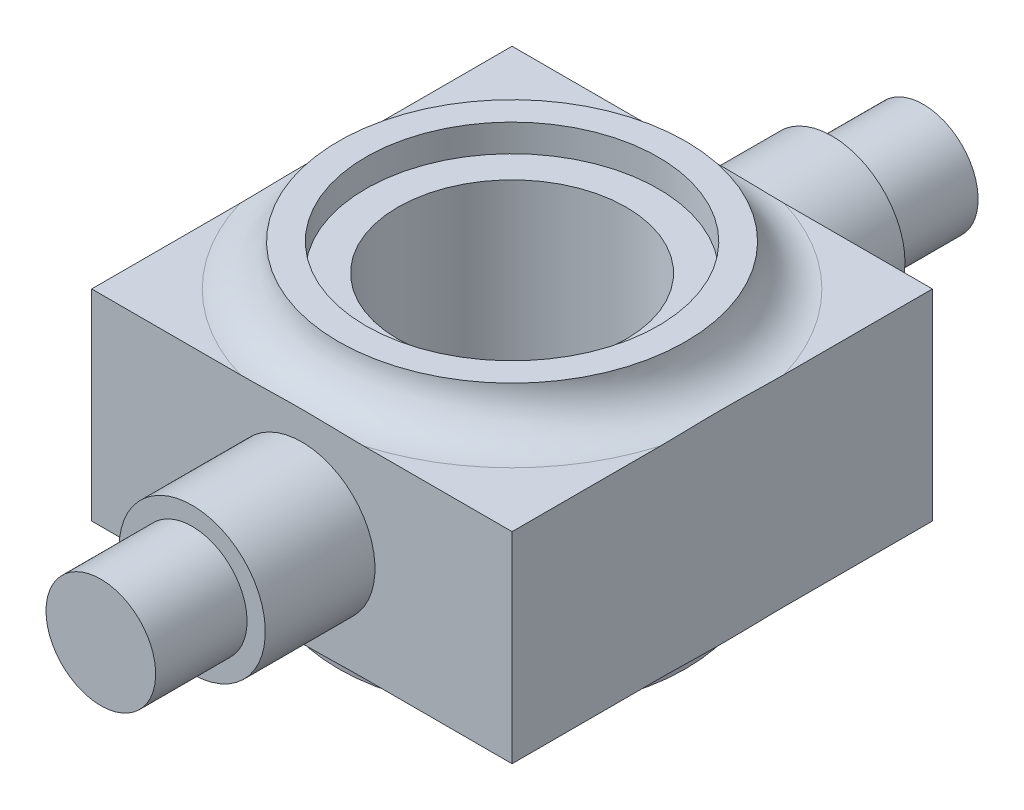
ISO-10303-21;
HEADER;
FILE_DESCRIPTION(('STEP AP214'),'2;1');
FILE_NAME('part.step','',(''),(''),'','','');
FILE_SCHEMA(('AUTOMOTIVE_DESIGN { 1 0 10303 214 1 1 1 1 }'));
ENDSEC;
DATA;
#1=APPLICATION_CONTEXT('core data for automotive mechanical design processes');
#2=APPLICATION_PROTOCOL_DEFINITION('international standard','automotive_design',2000,#1);
#3=PRODUCT_CONTEXT('',#1,'mechanical');
#4=PRODUCT('Part','Part','',(#3));
#5=PRODUCT_RELATED_PRODUCT_CATEGORY('part','',(#4));
#6=PRODUCT_DEFINITION_FORMATION('','',#4);
#7=PRODUCT_DEFINITION_CONTEXT('part definition',#1,'design');
#8=PRODUCT_DEFINITION('design','',#6,#7);
#9=PRODUCT_DEFINITION_SHAPE('','',#8);
#10=(LENGTH_UNIT() NAMED_UNIT(*) SI_UNIT(.MILLI.,.METRE.));
#11=(NAMED_UNIT(*) PLANE_ANGLE_UNIT() SI_UNIT($,.RADIAN.));
#12=(NAMED_UNIT(*) SI_UNIT($,.STERADIAN.) SOLID_ANGLE_UNIT());
#13=UNCERTAINTY_MEASURE_WITH_UNIT(LENGTH_MEASURE(1.E-05),#10,'distance_accuracy_value','');
#14=(GEOMETRIC_REPRESENTATION_CONTEXT(3) GLOBAL_UNCERTAINTY_ASSIGNED_CONTEXT((#13)) GLOBAL_UNIT_ASSIGNED_CONTEXT((#10,
#11,#12)) REPRESENTATION_CONTEXT('',''));
#15=CARTESIAN_POINT('',(0.,0.,0.));
#16=DIRECTION('',(0.,0.,1.));
#17=DIRECTION('',(1.,0.,0.));
#18=AXIS2_PLACEMENT_3D('',#15,#16,#17);
#19=CARTESIAN_POINT('',(0.,-11.,0.));
#20=DIRECTION('',(0.,-1.,0.));
#21=DIRECTION('',(0.,0.,-1.));
#22=AXIS2_PLACEMENT_3D('',#19,#20,#21);
#23=PLANE('',#22);
#24=DIRECTION('',(-1.,0.,0.));
#25=VECTOR('',#24,1.);
#26=CARTESIAN_POINT('',(-23.,-11.,-23.));
#27=LINE('',#26,#25);
#28=CARTESIAN_POINT('',(-6.76739337191637,-11.,-23.));
#29=VERTEX_POINT('',#28);
#30=CARTESIAN_POINT('',(-23.,-11.,-23.));
#31=VERTEX_POINT('',#30);
#32=EDGE_CURVE('E282',#29,#31,#27,.T.);
#33=ORIENTED_EDGE('',*,*,#32,.F.);
#34=CARTESIAN_POINT('',(0.,-11.,0.));
#35=DIRECTION('',(0.,-1.,0.));
#36=DIRECTION('',(0.,0.,-1.));
#37=AXIS2_PLACEMENT_3D('',#34,#35,#36);
#38=CIRCLE('',#37,23.9749371855331);
#39=CARTESIAN_POINT('',(-23.,-11.,-6.76739337191636));
#40=VERTEX_POINT('',#39);
#41=EDGE_CURVE('E218',#29,#40,#38,.F.);
#42=ORIENTED_EDGE('',*,*,#41,.T.);
#43=DIRECTION('',(0.,0.,1.));
#44=VECTOR('',#43,1.);
#45=CARTESIAN_POINT('',(-23.,-11.,23.));
#46=LINE('',#45,#44);
#47=EDGE_CURVE('E286',#31,#40,#46,.T.);
#48=ORIENTED_EDGE('',*,*,#47,.F.);
#49=EDGE_LOOP('',(#33,#42,#48));
#50=FACE_BOUND('',#49,.T.);
#51=ADVANCED_FACE('F33',(#50),#23,.T.);
#52=CARTESIAN_POINT('',(-23.,-11.,6.76739337191636));
#53=VERTEX_POINT('',#52);
#54=CARTESIAN_POINT('',(-23.,-11.,23.));
#55=VERTEX_POINT('',#54);
#56=EDGE_CURVE('E285',#53,#55,#46,.T.);
#57=ORIENTED_EDGE('',*,*,#56,.F.);
#58=CARTESIAN_POINT('',(0.,-11.,0.));
#59=DIRECTION('',(0.,-1.,0.));
#60=DIRECTION('',(0.,0.,-1.));
#61=AXIS2_PLACEMENT_3D('',#58,#59,#60);
#62=CIRCLE('',#61,23.9749371855331);
#63=CARTESIAN_POINT('',(-6.76739337191637,-11.,23.));
#64=VERTEX_POINT('',#63);
#65=EDGE_CURVE('E304',#53,#64,#62,.F.);
#66=ORIENTED_EDGE('',*,*,#65,.T.);
#67=DIRECTION('',(1.,0.,0.));
#68=VECTOR('',#67,1.);
#69=CARTESIAN_POINT('',(-23.,-11.,23.));
#70=LINE('',#69,#68);
#71=EDGE_CURVE('E136',#55,#64,#70,.T.);
#72=ORIENTED_EDGE('',*,*,#71,.F.);
#73=EDGE_LOOP('',(#57,#66,#72));
#74=FACE_BOUND('',#73,.T.);
#75=ADVANCED_FACE('F302',(#74),#23,.T.);
#76=CARTESIAN_POINT('',(6.76739337191637,-11.,23.));
#77=VERTEX_POINT('',#76);
#78=CARTESIAN_POINT('',(23.,-11.,23.));
#79=VERTEX_POINT('',#78);
#80=EDGE_CURVE('E289',#77,#79,#70,.T.);
#81=ORIENTED_EDGE('',*,*,#80,.F.);
#82=CARTESIAN_POINT('',(0.,-11.,0.));
#83=DIRECTION('',(0.,-1.,0.));
#84=DIRECTION('',(0.,0.,-1.));
#85=AXIS2_PLACEMENT_3D('',#82,#83,#84);
#86=CIRCLE('',#85,23.9749371855331);
#87=CARTESIAN_POINT('',(23.,-11.,6.76739337191638));
#88=VERTEX_POINT('',#87);
#89=EDGE_CURVE('E306',#77,#88,#86,.F.);
#90=ORIENTED_EDGE('',*,*,#89,.T.);
#91=DIRECTION('',(0.,0.,-1.));
#92=VECTOR('',#91,1.);
#93=CARTESIAN_POINT('',(23.,-11.,23.));
#94=LINE('',#93,#92);
#95=EDGE_CURVE('E279',#79,#88,#94,.T.);
#96=ORIENTED_EDGE('',*,*,#95,.F.);
#97=EDGE_LOOP('',(#81,#90,#96));
#98=FACE_BOUND('',#97,.T.);
#99=ADVANCED_FACE('F313',(#98),#23,.T.);
#100=CARTESIAN_POINT('',(0.,11.,0.));
#101=DIRECTION('',(0.,-1.,0.));
#102=DIRECTION('',(0.,0.,-1.));
#103=AXIS2_PLACEMENT_3D('',#100,#101,#102);
#104=PLANE('',#103);
#105=DIRECTION('',(-1.,0.,0.));
#106=VECTOR('',#105,1.);
#107=CARTESIAN_POINT('',(-23.,11.,-23.));
#108=LINE('',#107,#106);
#109=CARTESIAN_POINT('',(23.,11.,-23.));
#110=VERTEX_POINT('',#109);
#111=CARTESIAN_POINT('',(6.76739337191637,11.,-23.));
#112=VERTEX_POINT('',#111);
#113=EDGE_CURVE('E130',#110,#112,#108,.T.);
#114=ORIENTED_EDGE('',*,*,#113,.T.);
#115=CARTESIAN_POINT('',(0.,11.,0.));
#116=DIRECTION('',(0.,-1.,0.));
#117=DIRECTION('',(0.,0.,-1.));
#118=AXIS2_PLACEMENT_3D('',#115,#116,#117);
#119=CIRCLE('',#118,23.9749371855331);
#120=CARTESIAN_POINT('',(23.,11.,-6.76739337191638));
#121=VERTEX_POINT('',#120);
#122=EDGE_CURVE('E132',#112,#121,#119,.T.);
#123=ORIENTED_EDGE('',*,*,#122,.T.);
#124=DIRECTION('',(0.,0.,-1.));
#125=VECTOR('',#124,1.);
#126=CARTESIAN_POINT('',(23.,11.,23.));
#127=LINE('',#126,#125);
#128=EDGE_CURVE('E127',#121,#110,#127,.T.);
#129=ORIENTED_EDGE('',*,*,#128,.T.);
#130=EDGE_LOOP('',(#114,#123,#129));
#131=FACE_BOUND('',#130,.T.);
#132=ADVANCED_FACE('F129',(#131),#104,.F.);
#133=CARTESIAN_POINT('',(23.,11.,23.));
#134=VERTEX_POINT('',#133);
#135=CARTESIAN_POINT('',(23.,11.,6.76739337191638));
#136=VERTEX_POINT('',#135);
#137=EDGE_CURVE('E135',#134,#136,#127,.T.);
#138=ORIENTED_EDGE('',*,*,#137,.T.);
#139=CARTESIAN_POINT('',(0.,11.,0.));
#140=DIRECTION('',(0.,-1.,0.));
#141=DIRECTION('',(0.,0.,-1.));
#142=AXIS2_PLACEMENT_3D('',#139,#140,#141);
#143=CIRCLE('',#142,23.9749371855331);
#144=CARTESIAN_POINT('',(6.76739337191637,11.,23.));
#145=VERTEX_POINT('',#144);
#146=EDGE_CURVE('E160',#136,#145,#143,.T.);
#147=ORIENTED_EDGE('',*,*,#146,.T.);
#148=DIRECTION('',(1.,0.,0.));
#149=VECTOR('',#148,1.);
#150=CARTESIAN_POINT('',(-23.,11.,23.));
#151=LINE('',#150,#149);
#152=EDGE_CURVE('E274',#145,#134,#151,.T.);
#153=ORIENTED_EDGE('',*,*,#152,.T.);
#154=EDGE_LOOP('',(#138,#147,#153));
#155=FACE_BOUND('',#154,.T.);
#156=ADVANCED_FACE('F329',(#155),#104,.F.);
#157=CARTESIAN_POINT('',(-23.,11.,23.));
#158=VERTEX_POINT('',#157);
#159=CARTESIAN_POINT('',(-6.76739337191637,11.,23.));
#160=VERTEX_POINT('',#159);
#161=EDGE_CURVE('E275',#158,#160,#151,.T.);
#162=ORIENTED_EDGE('',*,*,#161,.T.);
#163=CARTESIAN_POINT('',(0.,11.,0.));
#164=DIRECTION('',(0.,-1.,0.));
#165=DIRECTION('',(0.,0.,-1.));
#166=AXIS2_PLACEMENT_3D('',#163,#164,#165);
#167=CIRCLE('',#166,23.9749371855331);
#168=CARTESIAN_POINT('',(-23.,11.,6.76739337191636));
#169=VERTEX_POINT('',#168);
#170=EDGE_CURVE('E152',#160,#169,#167,.T.);
#171=ORIENTED_EDGE('',*,*,#170,.T.);
#172=DIRECTION('',(0.,0.,1.));
#173=VECTOR('',#172,1.);
#174=CARTESIAN_POINT('',(-23.,11.,23.));
#175=LINE('',#174,#173);
#176=EDGE_CURVE('E144',#169,#158,#175,.T.);
#177=ORIENTED_EDGE('',*,*,#176,.T.);
#178=EDGE_LOOP('',(#162,#171,#177));
#179=FACE_BOUND('',#178,.T.);
#180=ADVANCED_FACE('F333',(#179),#104,.F.);
#181=CARTESIAN_POINT('',(23.,11.,23.));
#182=DIRECTION('',(-1.,0.,0.));
#183=DIRECTION('',(0.,0.,1.));
#184=AXIS2_PLACEMENT_3D('',#181,#182,#183);
#185=PLANE('',#184);
#186=CARTESIAN_POINT('',(23.,11.,-6.76739337191638));
#187=CARTESIAN_POINT('',(23.,11.0000046602095,-6.55901806429992));
#188=CARTESIAN_POINT('',(23.,11.0010371661889,-6.35064690604922));
#189=CARTESIAN_POINT('',(23.,11.0046695298709,-5.93392394603991));
#190=CARTESIAN_POINT('',(23.,11.0072693401354,-5.72557214388633));
#191=CARTESIAN_POINT('',(23.,11.0166871941468,-5.10055563160224));
#192=CARTESIAN_POINT('',(23.,11.0251237185398,-4.68391761999882));
#193=CARTESIAN_POINT('',(23.,11.0429512114527,-3.85065629878225));
#194=CARTESIAN_POINT('',(23.,11.0523422019658,-3.43403298972927));
#195=CARTESIAN_POINT('',(23.,11.0694105052815,-2.60074805054724));
#196=CARTESIAN_POINT('',(23.,11.0770878201331,-2.18408642046461));
#197=CARTESIAN_POINT('',(23.,11.0888661595854,-1.35072977430285));
#198=CARTESIAN_POINT('',(23.,11.0929673657651,-0.934034760993349));
#199=CARTESIAN_POINT('',(23.,11.0966694056595,-0.100624896742878));
#200=CARTESIAN_POINT('',(23.,11.0962702580181,0.31608995410876));
#201=CARTESIAN_POINT('',(23.,11.0910610596169,1.14946695656352));
#202=CARTESIAN_POINT('',(23.,11.086251252372,1.56612910980594));
#203=CARTESIAN_POINT('',(23.,11.0733104365428,2.3994013159547));
#204=CARTESIAN_POINT('',(23.,11.0651793972033,2.81601136834285));
#205=CARTESIAN_POINT('',(23.,11.0501933939339,3.5271338264306));
#206=CARTESIAN_POINT('',(23.,11.0436626288243,3.82165363097128));
#207=CARTESIAN_POINT('',(23.,11.0309174384123,4.41069855888842));
#208=CARTESIAN_POINT('',(23.,11.0247030114199,4.70522368222805));
#209=CARTESIAN_POINT('',(23.,11.0137009920784,5.2943302743818));
#210=CARTESIAN_POINT('',(23.,11.008913526168,5.58891174587603));
#211=CARTESIAN_POINT('',(23.,11.0020759259193,6.17812173079167));
#212=CARTESIAN_POINT('',(23.,11.0000259523707,6.47275024595981));
#213=CARTESIAN_POINT('',(23.,11.,6.76739337191638));
#214=B_SPLINE_CURVE_WITH_KNOTS('',3,(#186,#187,#188,#189,#190,#191,#192,#193,#194,#195,#196,
#197,#198,#199,#200,#201,#202,#203,#204,#205,#206,#207,#208,#209,#210,#211,#212,#213),
.UNSPECIFIED.,.F.,.F.,(4,2,2,2,2,2,2,2,2,2,2,2,2,4),(0.,0.625117611237803,1.25021630282165,
2.50037710119541,3.75056671287119,5.00075482962492,6.25087946361781,7.50099891861197,
8.75104935800979,10.0011113733134,10.8848882635173,11.7686604312962,12.6525108841353,
13.5364132486729),.UNSPECIFIED.);
#215=EDGE_CURVE('E163',#121,#136,#214,.T.);
#216=ORIENTED_EDGE('',*,*,#215,.T.);
#217=ORIENTED_EDGE('',*,*,#137,.F.);
#218=DIRECTION('',(0.,-1.,0.));
#219=VECTOR('',#218,1.);
#220=CARTESIAN_POINT('',(23.,11.,23.));
#221=LINE('',#220,#219);
#222=EDGE_CURVE('E278',#134,#79,#221,.T.);
#223=ORIENTED_EDGE('',*,*,#222,.T.);
#224=ORIENTED_EDGE('',*,*,#95,.T.);
#225=CARTESIAN_POINT('',(23.,-11.,6.76739337191638));
#226=CARTESIAN_POINT('',(23.,-11.0000046602095,6.55901806429992));
#227=CARTESIAN_POINT('',(23.,-11.0010371661889,6.35064690604922));
#228=CARTESIAN_POINT('',(23.,-11.0046695298709,5.93392394603991));
#229=CARTESIAN_POINT('',(23.,-11.0072693401354,5.72557214388633));
#230=CARTESIAN_POINT('',(23.,-11.0166871941468,5.10055563160224));
#231=CARTESIAN_POINT('',(23.,-11.0251237185398,4.68391761999882));
#232=CARTESIAN_POINT('',(23.,-11.0429512114527,3.85065629878225));
#233=CARTESIAN_POINT('',(23.,-11.0523422019658,3.43403298972927));
#234=CARTESIAN_POINT('',(23.,-11.0694105052815,2.60074805054724));
#235=CARTESIAN_POINT('',(23.,-11.0770878201331,2.18408642046461));
#236=CARTESIAN_POINT('',(23.,-11.0888661595854,1.35072977430285));
#237=CARTESIAN_POINT('',(23.,-11.0929673657651,0.934034760993349));
#238=CARTESIAN_POINT('',(23.,-11.0966694056595,0.100624896742878));
#239=CARTESIAN_POINT('',(23.,-11.0962702580181,-0.31608995410876));
#240=CARTESIAN_POINT('',(23.,-11.0910610596169,-1.14946695656352));
#241=CARTESIAN_POINT('',(23.,-11.086251252372,-1.56612910980594));
#242=CARTESIAN_POINT('',(23.,-11.0733104365428,-2.3994013159547));
#243=CARTESIAN_POINT('',(23.,-11.0651793972033,-2.81601136834285));
#244=CARTESIAN_POINT('',(23.,-11.0501933939339,-3.5271338264306));
#245=CARTESIAN_POINT('',(23.,-11.0436626288243,-3.82165363097128));
#246=CARTESIAN_POINT('',(23.,-11.0309174384123,-4.41069855888842));
#247=CARTESIAN_POINT('',(23.,-11.0247030114199,-4.70522368222805));
#248=CARTESIAN_POINT('',(23.,-11.0137009920784,-5.2943302743818));
#249=CARTESIAN_POINT('',(23.,-11.008913526168,-5.58891174587603));
#250=CARTESIAN_POINT('',(23.,-11.0020759259193,-6.17812173079167));
#251=CARTESIAN_POINT('',(23.,-11.0000259523707,-6.47275024595981));
#252=CARTESIAN_POINT('',(23.,-11.,-6.76739337191638));
#253=B_SPLINE_CURVE_WITH_KNOTS('',3,(#225,#226,#227,#228,#229,#230,#231,#232,#233,#234,#235,
#236,#237,#238,#239,#240,#241,#242,#243,#244,#245,#246,#247,#248,#249,#250,#251,#252),
.UNSPECIFIED.,.F.,.F.,(4,2,2,2,2,2,2,2,2,2,2,2,2,4),(0.,0.625117611237803,1.25021630282165,
2.50037710119541,3.75056671287119,5.00075482962492,6.25087946361781,7.50099891861197,
8.75104935800979,10.0011113733134,10.8848882635173,11.7686604312962,12.6525108841353,
13.5364132486729),.UNSPECIFIED.);
#254=CARTESIAN_POINT('',(23.,-11.,-6.76739337191638));
#255=VERTEX_POINT('',#254);
#256=EDGE_CURVE('E225',#88,#255,#253,.T.);
#257=ORIENTED_EDGE('',*,*,#256,.T.);
#258=CARTESIAN_POINT('',(23.,-11.,-23.));
#259=VERTEX_POINT('',#258);
#260=EDGE_CURVE('E148',#255,#259,#94,.T.);
#261=ORIENTED_EDGE('',*,*,#260,.T.);
#262=DIRECTION('',(0.,-1.,0.));
#263=VECTOR('',#262,1.);
#264=CARTESIAN_POINT('',(23.,11.,-23.));
#265=LINE('',#264,#263);
#266=EDGE_CURVE('E140',#110,#259,#265,.T.);
#267=ORIENTED_EDGE('',*,*,#266,.F.);
#268=ORIENTED_EDGE('',*,*,#128,.F.);
#269=EDGE_LOOP('',(#216,#217,#223,#224,#257,#261,#267,#268));
#270=FACE_BOUND('',#269,.T.);
#271=ADVANCED_FACE('F147',(#270),#185,.F.);
#272=CARTESIAN_POINT('',(-23.,11.,-23.));
#273=DIRECTION('',(0.,0.,1.));
#274=DIRECTION('',(1.,0.,0.));
#275=AXIS2_PLACEMENT_3D('',#272,#273,#274);
#276=PLANE('',#275);
#277=CARTESIAN_POINT('',(0.,0.,-23.));
#278=DIRECTION('',(0.,0.,1.));
#279=DIRECTION('',(1.,0.,0.));
#280=AXIS2_PLACEMENT_3D('',#277,#278,#279);
#281=CIRCLE('',#280,8.);
#282=CARTESIAN_POINT('',(8.,0.,-23.));
#283=VERTEX_POINT('',#282);
#284=EDGE_CURVE('E38',#283,#283,#281,.F.);
#285=ORIENTED_EDGE('',*,*,#284,.F.);
#286=EDGE_LOOP('',(#285));
#287=FACE_BOUND('',#286,.T.);
#288=CARTESIAN_POINT('',(-6.76739337191637,11.,-23.));
#289=CARTESIAN_POINT('',(-6.55901806429991,11.0000046602095,-23.));
#290=CARTESIAN_POINT('',(-6.35064690604921,11.0010371661889,-23.));
#291=CARTESIAN_POINT('',(-5.9339239460399,11.0046695298709,-23.));
#292=CARTESIAN_POINT('',(-5.72557214388632,11.0072693401354,-23.));
#293=CARTESIAN_POINT('',(-5.10055563160223,11.0166871941468,-23.));
#294=CARTESIAN_POINT('',(-4.68391761999881,11.0251237185398,-23.));
#295=CARTESIAN_POINT('',(-3.85065629878225,11.0429512114527,-23.));
#296=CARTESIAN_POINT('',(-3.43403298972926,11.0523422019658,-23.));
#297=CARTESIAN_POINT('',(-2.60074805054723,11.0694105052815,-23.));
#298=CARTESIAN_POINT('',(-2.18408642046461,11.0770878201331,-23.));
#299=CARTESIAN_POINT('',(-1.35072977430284,11.0888661595854,-23.));
#300=CARTESIAN_POINT('',(-0.934034760993341,11.0929673657651,-23.));
#301=CARTESIAN_POINT('',(-0.10062489674287,11.0966694056595,-23.));
#302=CARTESIAN_POINT('',(0.316089954108768,11.0962702580181,-23.));
#303=CARTESIAN_POINT('',(1.14946695656352,11.0910610596169,-23.));
#304=CARTESIAN_POINT('',(1.56612910980594,11.086251252372,-23.));
#305=CARTESIAN_POINT('',(2.39940131595471,11.0733104365428,-23.));
#306=CARTESIAN_POINT('',(2.81601136834285,11.0651793972033,-23.));
#307=CARTESIAN_POINT('',(3.52713382643061,11.0501933939339,-23.));
#308=CARTESIAN_POINT('',(3.82165363097128,11.0436626288243,-23.));
#309=CARTESIAN_POINT('',(4.41069855888842,11.0309174384123,-23.));
#310=CARTESIAN_POINT('',(4.70522368222806,11.0247030114199,-23.));
#311=CARTESIAN_POINT('',(5.2943302743818,11.0137009920784,-23.));
#312=CARTESIAN_POINT('',(5.58891174587603,11.008913526168,-23.));
#313=CARTESIAN_POINT('',(6.17812173079166,11.0020759259193,-23.));
#314=CARTESIAN_POINT('',(6.47275024595981,11.0000259523707,-23.));
#315=CARTESIAN_POINT('',(6.76739337191637,11.,-23.));
#316=B_SPLINE_CURVE_WITH_KNOTS('',3,(#288,#289,#290,#291,#292,#293,#294,#295,#296,#297,#298,
#299,#300,#301,#302,#303,#304,#305,#306,#307,#308,#309,#310,#311,#312,#313,#314,#315),
.UNSPECIFIED.,.F.,.F.,(4,2,2,2,2,2,2,2,2,2,2,2,2,4),(0.,0.625117611237803,1.25021630282165,
2.50037710119541,3.75056671287119,5.00075482962492,6.25087946361781,7.50099891861197,
8.75104935800979,10.0011113733134,10.8848882635173,11.7686604312962,12.6525108841353,
13.5364132486728),.UNSPECIFIED.);
#317=CARTESIAN_POINT('',(-6.76739337191637,11.,-23.));
#318=VERTEX_POINT('',#317);
#319=EDGE_CURVE('E143',#318,#112,#316,.T.);
#320=ORIENTED_EDGE('',*,*,#319,.T.);
#321=ORIENTED_EDGE('',*,*,#113,.F.);
#322=ORIENTED_EDGE('',*,*,#266,.T.);
#323=CARTESIAN_POINT('',(6.76739337191637,-11.,-23.));
#324=VERTEX_POINT('',#323);
#325=EDGE_CURVE('E283',#259,#324,#27,.T.);
#326=ORIENTED_EDGE('',*,*,#325,.T.);
#327=CARTESIAN_POINT('',(6.76739337191637,-11.,-23.));
#328=CARTESIAN_POINT('',(6.55901806429991,-11.0000046602095,-23.));
#329=CARTESIAN_POINT('',(6.35064690604921,-11.0010371661889,-23.));
#330=CARTESIAN_POINT('',(5.9339239460399,-11.0046695298709,-23.));
#331=CARTESIAN_POINT('',(5.72557214388632,-11.0072693401354,-23.));
#332=CARTESIAN_POINT('',(5.10055563160223,-11.0166871941468,-23.));
#333=CARTESIAN_POINT('',(4.68391761999881,-11.0251237185398,-23.));
#334=CARTESIAN_POINT('',(3.85065629878225,-11.0429512114527,-23.));
#335=CARTESIAN_POINT('',(3.43403298972926,-11.0523422019658,-23.));
#336=CARTESIAN_POINT('',(2.60074805054723,-11.0694105052815,-23.));
#337=CARTESIAN_POINT('',(2.18408642046461,-11.0770878201331,-23.));
#338=CARTESIAN_POINT('',(1.35072977430284,-11.0888661595854,-23.));
#339=CARTESIAN_POINT('',(0.934034760993341,-11.0929673657651,-23.));
#340=CARTESIAN_POINT('',(0.10062489674287,-11.0966694056595,-23.));
#341=CARTESIAN_POINT('',(-0.316089954108768,-11.0962702580181,-23.));
#342=CARTESIAN_POINT('',(-1.14946695656352,-11.0910610596169,-23.));
#343=CARTESIAN_POINT('',(-1.56612910980594,-11.086251252372,-23.));
#344=CARTESIAN_POINT('',(-2.39940131595471,-11.0733104365428,-23.));
#345=CARTESIAN_POINT('',(-2.81601136834285,-11.0651793972033,-23.));
#346=CARTESIAN_POINT('',(-3.52713382643061,-11.0501933939339,-23.));
#347=CARTESIAN_POINT('',(-3.82165363097128,-11.0436626288243,-23.));
#348=CARTESIAN_POINT('',(-4.41069855888842,-11.0309174384123,-23.));
#349=CARTESIAN_POINT('',(-4.70522368222806,-11.0247030114199,-23.));
#350=CARTESIAN_POINT('',(-5.2943302743818,-11.0137009920784,-23.));
#351=CARTESIAN_POINT('',(-5.58891174587603,-11.008913526168,-23.));
#352=CARTESIAN_POINT('',(-6.17812173079166,-11.0020759259193,-23.));
#353=CARTESIAN_POINT('',(-6.47275024595981,-11.0000259523707,-23.));
#354=CARTESIAN_POINT('',(-6.76739337191637,-11.,-23.));
#355=B_SPLINE_CURVE_WITH_KNOTS('',3,(#327,#328,#329,#330,#331,#332,#333,#334,#335,#336,#337,
#338,#339,#340,#341,#342,#343,#344,#345,#346,#347,#348,#349,#350,#351,#352,#353,#354),
.UNSPECIFIED.,.F.,.F.,(4,2,2,2,2,2,2,2,2,2,2,2,2,4),(0.,0.625117611237803,1.25021630282165,
2.50037710119541,3.75056671287119,5.00075482962492,6.25087946361781,7.50099891861197,
8.75104935800979,10.0011113733134,10.8848882635173,11.7686604312962,12.6525108841353,
13.5364132486728),.UNSPECIFIED.);
#356=EDGE_CURVE('E50',#324,#29,#355,.T.);
#357=ORIENTED_EDGE('',*,*,#356,.T.);
#358=ORIENTED_EDGE('',*,*,#32,.T.);
#359=DIRECTION('',(0.,-1.,0.));
#360=VECTOR('',#359,1.);
#361=CARTESIAN_POINT('',(-23.,11.,-23.));
#362=LINE('',#361,#360);
#363=CARTESIAN_POINT('',(-23.,11.,-23.));
#364=VERTEX_POINT('',#363);
#365=EDGE_CURVE('E150',#364,#31,#362,.T.);
#366=ORIENTED_EDGE('',*,*,#365,.F.);
#367=EDGE_CURVE('E145',#318,#364,#108,.T.);
#368=ORIENTED_EDGE('',*,*,#367,.F.);
#369=EDGE_LOOP('',(#320,#321,#322,#326,#357,#358,#366,#368));
#370=FACE_BOUND('',#369,.T.);
#371=ADVANCED_FACE('F139',(#287,#370),#276,.F.);
#372=CARTESIAN_POINT('',(-23.,11.,23.));
#373=DIRECTION('',(1.,0.,0.));
#374=DIRECTION('',(0.,0.,-1.));
#375=AXIS2_PLACEMENT_3D('',#372,#373,#374);
#376=PLANE('',#375);
#377=CARTESIAN_POINT('',(-23.,11.,6.76739337191636));
#378=CARTESIAN_POINT('',(-23.,11.0000046602095,6.55901806429989));
#379=CARTESIAN_POINT('',(-23.,11.0010371661889,6.35064690604919));
#380=CARTESIAN_POINT('',(-23.,11.0046695298709,5.93392394603989));
#381=CARTESIAN_POINT('',(-23.,11.0072693401354,5.72557214388631));
#382=CARTESIAN_POINT('',(-23.,11.0166871941468,5.10055563160221));
#383=CARTESIAN_POINT('',(-23.,11.0251237185398,4.6839176199988));
#384=CARTESIAN_POINT('',(-23.,11.0429512114527,3.85065629878223));
#385=CARTESIAN_POINT('',(-23.,11.0523422019658,3.43403298972924));
#386=CARTESIAN_POINT('',(-23.,11.0694105052815,2.60074805054721));
#387=CARTESIAN_POINT('',(-23.,11.0770878201331,2.18408642046459));
#388=CARTESIAN_POINT('',(-23.,11.0888661595853,1.35072977430283));
#389=CARTESIAN_POINT('',(-23.,11.0929673657651,0.934034760993326));
#390=CARTESIAN_POINT('',(-23.,11.0966694056595,0.100624896742854));
#391=CARTESIAN_POINT('',(-23.,11.0962702580181,-0.316089954108783));
#392=CARTESIAN_POINT('',(-23.,11.0910610596169,-1.14946695656354));
#393=CARTESIAN_POINT('',(-23.,11.086251252372,-1.56612910980596));
#394=CARTESIAN_POINT('',(-23.,11.0733104365428,-2.39940131595473));
#395=CARTESIAN_POINT('',(-23.,11.0651793972033,-2.81601136834287));
#396=CARTESIAN_POINT('',(-23.,11.0501933939339,-3.52713382643062));
#397=CARTESIAN_POINT('',(-23.,11.0436626288243,-3.8216536309713));
#398=CARTESIAN_POINT('',(-23.,11.0309174384123,-4.41069855888843));
#399=CARTESIAN_POINT('',(-23.,11.0247030114199,-4.70522368222806));
#400=CARTESIAN_POINT('',(-23.,11.0137009920784,-5.2943302743818));
#401=CARTESIAN_POINT('',(-23.,11.008913526168,-5.58891174587602));
#402=CARTESIAN_POINT('',(-23.,11.0020759259193,-6.17812173079165));
#403=CARTESIAN_POINT('',(-23.,11.0000259523707,-6.47275024595979));
#404=CARTESIAN_POINT('',(-23.,11.,-6.76739337191636));
#405=B_SPLINE_CURVE_WITH_KNOTS('',3,(#377,#378,#379,#380,#381,#382,#383,#384,#385,#386,#387,
#388,#389,#390,#391,#392,#393,#394,#395,#396,#397,#398,#399,#400,#401,#402,#403,#404),
.UNSPECIFIED.,.F.,.F.,(4,2,2,2,2,2,2,2,2,2,2,2,2,4),(0.,0.625117611237802,1.25021630282165,
2.50037710119541,3.75056671287119,5.00075482962492,6.25087946361781,7.50099891861197,
8.75104935800979,10.0011113733134,10.8848882635173,11.7686604312962,12.6525108841353,
13.5364132486728),.UNSPECIFIED.);
#406=CARTESIAN_POINT('',(-23.,11.,-6.76739337191636));
#407=VERTEX_POINT('',#406);
#408=EDGE_CURVE('E189',#169,#407,#405,.T.);
#409=ORIENTED_EDGE('',*,*,#408,.T.);
#410=EDGE_CURVE('E271',#364,#407,#175,.T.);
#411=ORIENTED_EDGE('',*,*,#410,.F.);
#412=ORIENTED_EDGE('',*,*,#365,.T.);
#413=ORIENTED_EDGE('',*,*,#47,.T.);
#414=CARTESIAN_POINT('',(-23.,-11.,-6.76739337191636));
#415=CARTESIAN_POINT('',(-23.,-11.0000046602095,-6.55901806429989));
#416=CARTESIAN_POINT('',(-23.,-11.0010371661889,-6.35064690604919));
#417=CARTESIAN_POINT('',(-23.,-11.0046695298709,-5.93392394603989));
#418=CARTESIAN_POINT('',(-23.,-11.0072693401354,-5.72557214388631));
#419=CARTESIAN_POINT('',(-23.,-11.0166871941468,-5.10055563160221));
#420=CARTESIAN_POINT('',(-23.,-11.0251237185398,-4.6839176199988));
#421=CARTESIAN_POINT('',(-23.,-11.0429512114527,-3.85065629878223));
#422=CARTESIAN_POINT('',(-23.,-11.0523422019658,-3.43403298972924));
#423=CARTESIAN_POINT('',(-23.,-11.0694105052815,-2.60074805054721));
#424=CARTESIAN_POINT('',(-23.,-11.0770878201331,-2.18408642046459));
#425=CARTESIAN_POINT('',(-23.,-11.0888661595853,-1.35072977430283));
#426=CARTESIAN_POINT('',(-23.,-11.0929673657651,-0.934034760993326));
#427=CARTESIAN_POINT('',(-23.,-11.0966694056595,-0.100624896742854));
#428=CARTESIAN_POINT('',(-23.,-11.0962702580181,0.316089954108783));
#429=CARTESIAN_POINT('',(-23.,-11.0910610596169,1.14946695656354));
#430=CARTESIAN_POINT('',(-23.,-11.086251252372,1.56612910980596));
#431=CARTESIAN_POINT('',(-23.,-11.0733104365428,2.39940131595473));
#432=CARTESIAN_POINT('',(-23.,-11.0651793972033,2.81601136834287));
#433=CARTESIAN_POINT('',(-23.,-11.0501933939339,3.52713382643062));
#434=CARTESIAN_POINT('',(-23.,-11.0436626288243,3.8216536309713));
#435=CARTESIAN_POINT('',(-23.,-11.0309174384123,4.41069855888843));
#436=CARTESIAN_POINT('',(-23.,-11.0247030114199,4.70522368222806));
#437=CARTESIAN_POINT('',(-23.,-11.0137009920784,5.2943302743818));
#438=CARTESIAN_POINT('',(-23.,-11.008913526168,5.58891174587602));
#439=CARTESIAN_POINT('',(-23.,-11.0020759259193,6.17812173079165));
#440=CARTESIAN_POINT('',(-23.,-11.0000259523707,6.47275024595979));
#441=CARTESIAN_POINT('',(-23.,-11.,6.76739337191636));
#442=B_SPLINE_CURVE_WITH_KNOTS('',3,(#414,#415,#416,#417,#418,#419,#420,#421,#422,#423,#424,
#425,#426,#427,#428,#429,#430,#431,#432,#433,#434,#435,#436,#437,#438,#439,#440,#441),
.UNSPECIFIED.,.F.,.F.,(4,2,2,2,2,2,2,2,2,2,2,2,2,4),(0.,0.625117611237802,1.25021630282165,
2.50037710119541,3.75056671287119,5.00075482962492,6.25087946361781,7.50099891861197,
8.75104935800979,10.0011113733134,10.8848882635173,11.7686604312962,12.6525108841353,
13.5364132486728),.UNSPECIFIED.);
#443=EDGE_CURVE('E210',#40,#53,#442,.T.);
#444=ORIENTED_EDGE('',*,*,#443,.T.);
#445=ORIENTED_EDGE('',*,*,#56,.T.);
#446=DIRECTION('',(0.,-1.,0.));
#447=VECTOR('',#446,1.);
#448=CARTESIAN_POINT('',(-23.,11.,23.));
#449=LINE('',#448,#447);
#450=EDGE_CURVE('E155',#158,#55,#449,.T.);
#451=ORIENTED_EDGE('',*,*,#450,.F.);
#452=ORIENTED_EDGE('',*,*,#176,.F.);
#453=EDGE_LOOP('',(#409,#411,#412,#413,#444,#445,#451,#452));
#454=FACE_BOUND('',#453,.T.);
#455=ADVANCED_FACE('F200',(#454),#376,.F.);
#456=CARTESIAN_POINT('',(-23.,11.,23.));
#457=DIRECTION('',(0.,0.,-1.));
#458=DIRECTION('',(-1.,0.,0.));
#459=AXIS2_PLACEMENT_3D('',#456,#457,#458);
#460=PLANE('',#459);
#461=CARTESIAN_POINT('',(0.,0.,23.));
#462=DIRECTION('',(0.,0.,-1.));
#463=DIRECTION('',(-1.,0.,0.));
#464=AXIS2_PLACEMENT_3D('',#461,#462,#463);
#465=CIRCLE('',#464,8.);
#466=CARTESIAN_POINT('',(-8.,0.,23.));
#467=VERTEX_POINT('',#466);
#468=EDGE_CURVE('E615',#467,#467,#465,.T.);
#469=ORIENTED_EDGE('',*,*,#468,.T.);
#470=EDGE_LOOP('',(#469));
#471=FACE_BOUND('',#470,.T.);
#472=CARTESIAN_POINT('',(6.76739337191637,11.,23.));
#473=CARTESIAN_POINT('',(6.55901806429991,11.0000046602095,23.));
#474=CARTESIAN_POINT('',(6.35064690604921,11.0010371661889,23.));
#475=CARTESIAN_POINT('',(5.9339239460399,11.0046695298709,23.));
#476=CARTESIAN_POINT('',(5.72557214388632,11.0072693401354,23.));
#477=CARTESIAN_POINT('',(5.10055563160223,11.0166871941468,23.));
#478=CARTESIAN_POINT('',(4.68391761999881,11.0251237185398,23.));
#479=CARTESIAN_POINT('',(3.85065629878225,11.0429512114527,23.));
#480=CARTESIAN_POINT('',(3.43403298972926,11.0523422019658,23.));
#481=CARTESIAN_POINT('',(2.60074805054723,11.0694105052815,23.));
#482=CARTESIAN_POINT('',(2.18408642046461,11.0770878201331,23.));
#483=CARTESIAN_POINT('',(1.35072977430284,11.0888661595854,23.));
#484=CARTESIAN_POINT('',(0.934034760993341,11.0929673657651,23.));
#485=CARTESIAN_POINT('',(0.10062489674287,11.0966694056595,23.));
#486=CARTESIAN_POINT('',(-0.316089954108768,11.0962702580181,23.));
#487=CARTESIAN_POINT('',(-1.14946695656352,11.0910610596169,23.));
#488=CARTESIAN_POINT('',(-1.56612910980594,11.086251252372,23.));
#489=CARTESIAN_POINT('',(-2.39940131595471,11.0733104365428,23.));
#490=CARTESIAN_POINT('',(-2.81601136834285,11.0651793972033,23.));
#491=CARTESIAN_POINT('',(-3.52713382643061,11.0501933939339,23.));
#492=CARTESIAN_POINT('',(-3.82165363097128,11.0436626288243,23.));
#493=CARTESIAN_POINT('',(-4.41069855888842,11.0309174384123,23.));
#494=CARTESIAN_POINT('',(-4.70522368222806,11.0247030114199,23.));
#495=CARTESIAN_POINT('',(-5.2943302743818,11.0137009920784,23.));
#496=CARTESIAN_POINT('',(-5.58891174587603,11.008913526168,23.));
#497=CARTESIAN_POINT('',(-6.17812173079166,11.0020759259193,23.));
#498=CARTESIAN_POINT('',(-6.47275024595981,11.0000259523707,23.));
#499=CARTESIAN_POINT('',(-6.76739337191637,11.,23.));
#500=B_SPLINE_CURVE_WITH_KNOTS('',3,(#472,#473,#474,#475,#476,#477,#478,#479,#480,#481,#482,
#483,#484,#485,#486,#487,#488,#489,#490,#491,#492,#493,#494,#495,#496,#497,#498,#499),
.UNSPECIFIED.,.F.,.F.,(4,2,2,2,2,2,2,2,2,2,2,2,2,4),(0.,0.625117611237803,1.25021630282165,
2.50037710119541,3.75056671287119,5.00075482962492,6.25087946361781,7.50099891861197,
8.75104935800979,10.0011113733134,10.8848882635173,11.7686604312962,12.6525108841353,
13.5364132486728),.UNSPECIFIED.);
#501=EDGE_CURVE('E170',#145,#160,#500,.T.);
#502=ORIENTED_EDGE('',*,*,#501,.T.);
#503=ORIENTED_EDGE('',*,*,#161,.F.);
#504=ORIENTED_EDGE('',*,*,#450,.T.);
#505=ORIENTED_EDGE('',*,*,#71,.T.);
#506=CARTESIAN_POINT('',(-6.76739337191637,-11.,23.));
#507=CARTESIAN_POINT('',(-6.55901806429991,-11.0000046602095,23.));
#508=CARTESIAN_POINT('',(-6.35064690604921,-11.0010371661889,23.));
#509=CARTESIAN_POINT('',(-5.9339239460399,-11.0046695298709,23.));
#510=CARTESIAN_POINT('',(-5.72557214388632,-11.0072693401354,23.));
#511=CARTESIAN_POINT('',(-5.10055563160223,-11.0166871941468,23.));
#512=CARTESIAN_POINT('',(-4.68391761999881,-11.0251237185398,23.));
#513=CARTESIAN_POINT('',(-3.85065629878225,-11.0429512114527,23.));
#514=CARTESIAN_POINT('',(-3.43403298972926,-11.0523422019658,23.));
#515=CARTESIAN_POINT('',(-2.60074805054723,-11.0694105052815,23.));
#516=CARTESIAN_POINT('',(-2.18408642046461,-11.0770878201331,23.));
#517=CARTESIAN_POINT('',(-1.35072977430284,-11.0888661595854,23.));
#518=CARTESIAN_POINT('',(-0.934034760993341,-11.0929673657651,23.));
#519=CARTESIAN_POINT('',(-0.10062489674287,-11.0966694056595,23.));
#520=CARTESIAN_POINT('',(0.316089954108768,-11.0962702580181,23.));
#521=CARTESIAN_POINT('',(1.14946695656352,-11.0910610596169,23.));
#522=CARTESIAN_POINT('',(1.56612910980594,-11.086251252372,23.));
#523=CARTESIAN_POINT('',(2.39940131595471,-11.0733104365428,23.));
#524=CARTESIAN_POINT('',(2.81601136834285,-11.0651793972033,23.));
#525=CARTESIAN_POINT('',(3.52713382643061,-11.0501933939339,23.));
#526=CARTESIAN_POINT('',(3.82165363097128,-11.0436626288243,23.));
#527=CARTESIAN_POINT('',(4.41069855888842,-11.0309174384123,23.));
#528=CARTESIAN_POINT('',(4.70522368222806,-11.0247030114199,23.));
#529=CARTESIAN_POINT('',(5.2943302743818,-11.0137009920784,23.));
#530=CARTESIAN_POINT('',(5.58891174587603,-11.008913526168,23.));
#531=CARTESIAN_POINT('',(6.17812173079166,-11.0020759259193,23.));
#532=CARTESIAN_POINT('',(6.47275024595981,-11.0000259523707,23.));
#533=CARTESIAN_POINT('',(6.76739337191637,-11.,23.));
#534=B_SPLINE_CURVE_WITH_KNOTS('',3,(#506,#507,#508,#509,#510,#511,#512,#513,#514,#515,#516,
#517,#518,#519,#520,#521,#522,#523,#524,#525,#526,#527,#528,#529,#530,#531,#532,#533),
.UNSPECIFIED.,.F.,.F.,(4,2,2,2,2,2,2,2,2,2,2,2,2,4),(0.,0.625117611237803,1.25021630282165,
2.50037710119541,3.75056671287119,5.00075482962492,6.25087946361781,7.50099891861197,
8.75104935800979,10.0011113733134,10.8848882635173,11.7686604312962,12.6525108841353,
13.5364132486728),.UNSPECIFIED.);
#535=EDGE_CURVE('E217',#64,#77,#534,.T.);
#536=ORIENTED_EDGE('',*,*,#535,.T.);
#537=ORIENTED_EDGE('',*,*,#80,.T.);
#538=ORIENTED_EDGE('',*,*,#222,.F.);
#539=ORIENTED_EDGE('',*,*,#152,.F.);
#540=EDGE_LOOP('',(#502,#503,#504,#505,#536,#537,#538,#539));
#541=FACE_BOUND('',#540,.T.);
#542=ADVANCED_FACE('F203',(#471,#541),#460,.F.);
#543=ORIENTED_EDGE('',*,*,#410,.T.);
#544=CARTESIAN_POINT('',(0.,11.,0.));
#545=DIRECTION('',(0.,-1.,0.));
#546=DIRECTION('',(0.,0.,-1.));
#547=AXIS2_PLACEMENT_3D('',#544,#545,#546);
#548=CIRCLE('',#547,23.9749371855331);
#549=EDGE_CURVE('E149',#407,#318,#548,.T.);
#550=ORIENTED_EDGE('',*,*,#549,.T.);
#551=ORIENTED_EDGE('',*,*,#367,.T.);
#552=EDGE_LOOP('',(#543,#550,#551));
#553=FACE_BOUND('',#552,.T.);
#554=ADVANCED_FACE('F334',(#553),#104,.F.);
#555=ORIENTED_EDGE('',*,*,#260,.F.);
#556=CARTESIAN_POINT('',(0.,-11.,0.));
#557=DIRECTION('',(0.,-1.,0.));
#558=DIRECTION('',(0.,0.,-1.));
#559=AXIS2_PLACEMENT_3D('',#556,#557,#558);
#560=CIRCLE('',#559,23.9749371855331);
#561=EDGE_CURVE('E58',#255,#324,#560,.F.);
#562=ORIENTED_EDGE('',*,*,#561,.T.);
#563=ORIENTED_EDGE('',*,*,#325,.F.);
#564=EDGE_LOOP('',(#555,#562,#563));
#565=FACE_BOUND('',#564,.T.);
#566=ADVANCED_FACE('F336',(#565),#23,.T.);
#567=CARTESIAN_POINT('',(0.,15.5,0.));
#568=DIRECTION('',(0.,1.,0.));
#569=DIRECTION('',(0.,0.,1.));
#570=AXIS2_PLACEMENT_3D('',#567,#568,#569);
#571=PLANE('',#570);
#572=CARTESIAN_POINT('',(0.,15.5,0.));
#573=DIRECTION('',(0.,1.,0.));
#574=DIRECTION('',(0.,0.,1.));
#575=AXIS2_PLACEMENT_3D('',#572,#573,#574);
#576=CIRCLE('',#575,16.);
#577=CARTESIAN_POINT('',(0.,15.5,16.));
#578=VERTEX_POINT('',#577);
#579=EDGE_CURVE('E261',#578,#578,#576,.T.);
#580=ORIENTED_EDGE('',*,*,#579,.F.);
#581=EDGE_LOOP('',(#580));
#582=FACE_BOUND('',#581,.T.);
#583=CARTESIAN_POINT('',(0.,15.5,0.));
#584=DIRECTION('',(0.,1.,0.));
#585=DIRECTION('',(0.,0.,1.));
#586=AXIS2_PLACEMENT_3D('',#583,#584,#585);
#587=CIRCLE('',#586,19.);
#588=CARTESIAN_POINT('',(0.,15.5,19.));
#589=VERTEX_POINT('',#588);
#590=EDGE_CURVE('E265',#589,#589,#587,.T.);
#591=ORIENTED_EDGE('',*,*,#590,.T.);
#592=EDGE_LOOP('',(#591));
#593=FACE_BOUND('',#592,.T.);
#594=ADVANCED_FACE('F183',(#582,#593),#571,.T.);
#595=CARTESIAN_POINT('',(0.,16.,0.));
#596=DIRECTION('',(0.,-1.,0.));
#597=DIRECTION('',(0.,0.,-1.));
#598=AXIS2_PLACEMENT_3D('',#595,#596,#597);
#599=TOROIDAL_SURFACE('',#598,23.9749371855331,5.);
#600=ORIENTED_EDGE('',*,*,#215,.F.);
#601=ORIENTED_EDGE('',*,*,#122,.F.);
#602=ORIENTED_EDGE('',*,*,#319,.F.);
#603=ORIENTED_EDGE('',*,*,#549,.F.);
#604=ORIENTED_EDGE('',*,*,#408,.F.);
#605=ORIENTED_EDGE('',*,*,#170,.F.);
#606=ORIENTED_EDGE('',*,*,#501,.F.);
#607=ORIENTED_EDGE('',*,*,#146,.F.);
#608=EDGE_LOOP('',(#600,#601,#602,#603,#604,#605,#606,#607));
#609=FACE_BOUND('',#608,.T.);
#610=ORIENTED_EDGE('',*,*,#590,.F.);
#611=EDGE_LOOP('',(#610));
#612=FACE_BOUND('',#611,.T.);
#613=ADVANCED_FACE('F179',(#609,#612),#599,.F.);
#614=CARTESIAN_POINT('',(0.,12.5,0.));
#615=DIRECTION('',(0.,1.,0.));
#616=DIRECTION('',(0.,0.,1.));
#617=AXIS2_PLACEMENT_3D('',#614,#615,#616);
#618=CYLINDRICAL_SURFACE('',#617,16.);
#619=CARTESIAN_POINT('',(0.,12.5,0.));
#620=DIRECTION('',(0.,1.,0.));
#621=DIRECTION('',(0.,0.,1.));
#622=AXIS2_PLACEMENT_3D('',#619,#620,#621);
#623=CIRCLE('',#622,16.);
#624=CARTESIAN_POINT('',(0.,12.5,16.));
#625=VERTEX_POINT('',#624);
#626=EDGE_CURVE('E262',#625,#625,#623,.T.);
#627=ORIENTED_EDGE('',*,*,#626,.F.);
#628=EDGE_LOOP('',(#627));
#629=FACE_BOUND('',#628,.T.);
#630=ORIENTED_EDGE('',*,*,#579,.T.);
#631=EDGE_LOOP('',(#630));
#632=FACE_BOUND('',#631,.T.);
#633=ADVANCED_FACE('F182',(#629,#632),#618,.F.);
#634=CARTESIAN_POINT('',(0.,12.5,0.));
#635=DIRECTION('',(0.,1.,0.));
#636=DIRECTION('',(0.,0.,1.));
#637=AXIS2_PLACEMENT_3D('',#634,#635,#636);
#638=PLANE('',#637);
#639=CARTESIAN_POINT('',(0.,12.5,0.));
#640=DIRECTION('',(0.,1.,0.));
#641=DIRECTION('',(0.,0.,1.));
#642=AXIS2_PLACEMENT_3D('',#639,#640,#641);
#643=CIRCLE('',#642,12.5);
#644=CARTESIAN_POINT('',(0.,12.5,12.5));
#645=VERTEX_POINT('',#644);
#646=EDGE_CURVE('E258',#645,#645,#643,.T.);
#647=ORIENTED_EDGE('',*,*,#646,.F.);
#648=EDGE_LOOP('',(#647));
#649=FACE_BOUND('',#648,.T.);
#650=ORIENTED_EDGE('',*,*,#626,.T.);
#651=EDGE_LOOP('',(#650));
#652=FACE_BOUND('',#651,.T.);
#653=ADVANCED_FACE('F472',(#649,#652),#638,.T.);
#654=CARTESIAN_POINT('',(0.,-11.,0.));
#655=DIRECTION('',(0.,1.,0.));
#656=DIRECTION('',(0.,0.,1.));
#657=AXIS2_PLACEMENT_3D('',#654,#655,#656);
#658=CYLINDRICAL_SURFACE('',#657,12.5);
#659=ORIENTED_EDGE('',*,*,#646,.T.);
#660=EDGE_LOOP('',(#659));
#661=FACE_BOUND('',#660,.T.);
#662=CARTESIAN_POINT('',(0.,-12.5,0.));
#663=DIRECTION('',(0.,-1.,0.));
#664=DIRECTION('',(0.,0.,-1.));
#665=AXIS2_PLACEMENT_3D('',#662,#663,#664);
#666=CIRCLE('',#665,12.5);
#667=CARTESIAN_POINT('',(0.,-12.5,-12.5));
#668=VERTEX_POINT('',#667);
#669=EDGE_CURVE('E235',#668,#668,#666,.T.);
#670=ORIENTED_EDGE('',*,*,#669,.T.);
#671=EDGE_LOOP('',(#670));
#672=FACE_BOUND('',#671,.T.);
#673=ADVANCED_FACE('F468',(#661,#672),#658,.F.);
#674=CARTESIAN_POINT('',(0.,-15.5,0.));
#675=DIRECTION('',(0.,-1.,0.));
#676=DIRECTION('',(0.,0.,1.));
#677=AXIS2_PLACEMENT_3D('',#674,#675,#676);
#678=PLANE('',#677);
#679=CARTESIAN_POINT('',(0.,-15.5,0.));
#680=DIRECTION('',(0.,1.,0.));
#681=DIRECTION('',(0.,0.,1.));
#682=AXIS2_PLACEMENT_3D('',#679,#680,#681);
#683=CIRCLE('',#682,16.);
#684=CARTESIAN_POINT('',(0.,-15.5,16.));
#685=VERTEX_POINT('',#684);
#686=EDGE_CURVE('E237',#685,#685,#683,.T.);
#687=ORIENTED_EDGE('',*,*,#686,.T.);
#688=EDGE_LOOP('',(#687));
#689=FACE_BOUND('',#688,.T.);
#690=CARTESIAN_POINT('',(0.,-15.5,0.));
#691=DIRECTION('',(0.,1.,0.));
#692=DIRECTION('',(0.,0.,1.));
#693=AXIS2_PLACEMENT_3D('',#690,#691,#692);
#694=CIRCLE('',#693,19.);
#695=CARTESIAN_POINT('',(0.,-15.5,19.));
#696=VERTEX_POINT('',#695);
#697=EDGE_CURVE('E254',#696,#696,#694,.T.);
#698=ORIENTED_EDGE('',*,*,#697,.F.);
#699=EDGE_LOOP('',(#698));
#700=FACE_BOUND('',#699,.T.);
#701=ADVANCED_FACE('F465',(#689,#700),#678,.T.);
#702=CARTESIAN_POINT('',(0.,-16.,0.));
#703=DIRECTION('',(0.,-1.,0.));
#704=DIRECTION('',(0.,0.,-1.));
#705=AXIS2_PLACEMENT_3D('',#702,#703,#704);
#706=TOROIDAL_SURFACE('',#705,23.9749371855331,5.);
#707=ORIENTED_EDGE('',*,*,#697,.T.);
#708=EDGE_LOOP('',(#707));
#709=FACE_BOUND('',#708,.T.);
#710=ORIENTED_EDGE('',*,*,#443,.F.);
#711=ORIENTED_EDGE('',*,*,#41,.F.);
#712=ORIENTED_EDGE('',*,*,#356,.F.);
#713=ORIENTED_EDGE('',*,*,#561,.F.);
#714=ORIENTED_EDGE('',*,*,#256,.F.);
#715=ORIENTED_EDGE('',*,*,#89,.F.);
#716=ORIENTED_EDGE('',*,*,#535,.F.);
#717=ORIENTED_EDGE('',*,*,#65,.F.);
#718=EDGE_LOOP('',(#710,#711,#712,#713,#714,#715,#716,#717));
#719=FACE_BOUND('',#718,.T.);
#720=ADVANCED_FACE('F35',(#709,#719),#706,.F.);
#721=CARTESIAN_POINT('',(0.,-12.5,0.));
#722=DIRECTION('',(0.,-1.,0.));
#723=DIRECTION('',(0.,0.,-1.));
#724=AXIS2_PLACEMENT_3D('',#721,#722,#723);
#725=CYLINDRICAL_SURFACE('',#724,16.);
#726=CARTESIAN_POINT('',(0.,-12.5,0.));
#727=DIRECTION('',(0.,1.,0.));
#728=DIRECTION('',(0.,0.,1.));
#729=AXIS2_PLACEMENT_3D('',#726,#727,#728);
#730=CIRCLE('',#729,16.);
#731=CARTESIAN_POINT('',(0.,-12.5,16.));
#732=VERTEX_POINT('',#731);
#733=EDGE_CURVE('E242',#732,#732,#730,.T.);
#734=ORIENTED_EDGE('',*,*,#733,.T.);
#735=EDGE_LOOP('',(#734));
#736=FACE_BOUND('',#735,.T.);
#737=ORIENTED_EDGE('',*,*,#686,.F.);
#738=EDGE_LOOP('',(#737));
#739=FACE_BOUND('',#738,.T.);
#740=ADVANCED_FACE('F460',(#736,#739),#725,.F.);
#741=CARTESIAN_POINT('',(0.,-12.5,0.));
#742=DIRECTION('',(0.,-1.,0.));
#743=DIRECTION('',(0.,0.,1.));
#744=AXIS2_PLACEMENT_3D('',#741,#742,#743);
#745=PLANE('',#744);
#746=ORIENTED_EDGE('',*,*,#669,.F.);
#747=EDGE_LOOP('',(#746));
#748=FACE_BOUND('',#747,.T.);
#749=ORIENTED_EDGE('',*,*,#733,.F.);
#750=EDGE_LOOP('',(#749));
#751=FACE_BOUND('',#750,.T.);
#752=ADVANCED_FACE('F456',(#748,#751),#745,.T.);
#753=CARTESIAN_POINT('',(0.,0.,-35.));
#754=DIRECTION('',(0.,0.,1.));
#755=DIRECTION('',(1.,0.,0.));
#756=AXIS2_PLACEMENT_3D('',#753,#754,#755);
#757=CYLINDRICAL_SURFACE('',#756,8.);
#758=CARTESIAN_POINT('',(0.,0.,-35.));
#759=DIRECTION('',(0.,0.,-1.));
#760=DIRECTION('',(-1.,0.,0.));
#761=AXIS2_PLACEMENT_3D('',#758,#759,#760);
#762=CIRCLE('',#761,8.);
#763=CARTESIAN_POINT('',(-8.,0.,-35.));
#764=VERTEX_POINT('',#763);
#765=EDGE_CURVE('E238',#764,#764,#762,.T.);
#766=ORIENTED_EDGE('',*,*,#765,.F.);
#767=EDGE_LOOP('',(#766));
#768=FACE_BOUND('',#767,.T.);
#769=ORIENTED_EDGE('',*,*,#284,.T.);
#770=EDGE_LOOP('',(#769));
#771=FACE_BOUND('',#770,.T.);
#772=ADVANCED_FACE('F452',(#768,#771),#757,.T.);
#773=CARTESIAN_POINT('',(0.,0.,-35.));
#774=DIRECTION('',(0.,0.,-1.));
#775=DIRECTION('',(-1.,0.,0.));
#776=AXIS2_PLACEMENT_3D('',#773,#774,#775);
#777=PLANE('',#776);
#778=CARTESIAN_POINT('',(0.,0.,-35.));
#779=DIRECTION('',(0.,0.,-1.));
#780=DIRECTION('',(-1.,0.,0.));
#781=AXIS2_PLACEMENT_3D('',#778,#779,#780);
#782=CIRCLE('',#781,6.);
#783=CARTESIAN_POINT('',(-6.,0.,-35.));
#784=VERTEX_POINT('',#783);
#785=EDGE_CURVE('E11',#784,#784,#782,.T.);
#786=ORIENTED_EDGE('',*,*,#785,.F.);
#787=EDGE_LOOP('',(#786));
#788=FACE_BOUND('',#787,.T.);
#789=ORIENTED_EDGE('',*,*,#765,.T.);
#790=EDGE_LOOP('',(#789));
#791=FACE_BOUND('',#790,.T.);
#792=ADVANCED_FACE('F448',(#788,#791),#777,.T.);
#793=CARTESIAN_POINT('',(0.,0.,-45.));
#794=DIRECTION('',(0.,0.,1.));
#795=DIRECTION('',(1.,0.,0.));
#796=AXIS2_PLACEMENT_3D('',#793,#794,#795);
#797=CYLINDRICAL_SURFACE('',#796,6.);
#798=CARTESIAN_POINT('',(0.,0.,-45.));
#799=DIRECTION('',(0.,0.,-1.));
#800=DIRECTION('',(-1.,0.,0.));
#801=AXIS2_PLACEMENT_3D('',#798,#799,#800);
#802=CIRCLE('',#801,6.);
#803=CARTESIAN_POINT('',(-6.,0.,-45.));
#804=VERTEX_POINT('',#803);
#805=EDGE_CURVE('E245',#804,#804,#802,.T.);
#806=ORIENTED_EDGE('',*,*,#805,.F.);
#807=EDGE_LOOP('',(#806));
#808=FACE_BOUND('',#807,.T.);
#809=ORIENTED_EDGE('',*,*,#785,.T.);
#810=EDGE_LOOP('',(#809));
#811=FACE_BOUND('',#810,.T.);
#812=ADVANCED_FACE('F444',(#808,#811),#797,.T.);
#813=CARTESIAN_POINT('',(0.,0.,-45.));
#814=DIRECTION('',(0.,0.,-1.));
#815=DIRECTION('',(-1.,0.,0.));
#816=AXIS2_PLACEMENT_3D('',#813,#814,#815);
#817=PLANE('',#816);
#818=ORIENTED_EDGE('',*,*,#805,.T.);
#819=EDGE_LOOP('',(#818));
#820=FACE_BOUND('',#819,.T.);
#821=ADVANCED_FACE('F397',(#820),#817,.T.);
#822=CARTESIAN_POINT('',(0.,0.,35.));
#823=DIRECTION('',(0.,0.,-1.));
#824=DIRECTION('',(-1.,0.,0.));
#825=AXIS2_PLACEMENT_3D('',#822,#823,#824);
#826=CYLINDRICAL_SURFACE('',#825,8.);
#827=CARTESIAN_POINT('',(0.,0.,35.));
#828=DIRECTION('',(0.,0.,-1.));
#829=DIRECTION('',(-1.,0.,0.));
#830=AXIS2_PLACEMENT_3D('',#827,#828,#829);
#831=CIRCLE('',#830,8.);
#832=CARTESIAN_POINT('',(-8.,0.,35.));
#833=VERTEX_POINT('',#832);
#834=EDGE_CURVE('E250',#833,#833,#831,.T.);
#835=ORIENTED_EDGE('',*,*,#834,.T.);
#836=EDGE_LOOP('',(#835));
#837=FACE_BOUND('',#836,.T.);
#838=ORIENTED_EDGE('',*,*,#468,.F.);
#839=EDGE_LOOP('',(#838));
#840=FACE_BOUND('',#839,.T.);
#841=ADVANCED_FACE('F402',(#837,#840),#826,.T.);
#842=CARTESIAN_POINT('',(0.,0.,35.));
#843=DIRECTION('',(0.,0.,1.));
#844=DIRECTION('',(-1.,0.,0.));
#845=AXIS2_PLACEMENT_3D('',#842,#843,#844);
#846=PLANE('',#845);
#847=CARTESIAN_POINT('',(0.,0.,35.));
#848=DIRECTION('',(0.,0.,-1.));
#849=DIRECTION('',(-1.,0.,0.));
#850=AXIS2_PLACEMENT_3D('',#847,#848,#849);
#851=CIRCLE('',#850,6.);
#852=CARTESIAN_POINT('',(-6.,0.,35.));
#853=VERTEX_POINT('',#852);
#854=EDGE_CURVE('E616',#853,#853,#851,.T.);
#855=ORIENTED_EDGE('',*,*,#854,.T.);
#856=EDGE_LOOP('',(#855));
#857=FACE_BOUND('',#856,.T.);
#858=ORIENTED_EDGE('',*,*,#834,.F.);
#859=EDGE_LOOP('',(#858));
#860=FACE_BOUND('',#859,.T.);
#861=ADVANCED_FACE('F407',(#857,#860),#846,.T.);
#862=CARTESIAN_POINT('',(0.,0.,45.));
#863=DIRECTION('',(0.,0.,-1.));
#864=DIRECTION('',(-1.,0.,0.));
#865=AXIS2_PLACEMENT_3D('',#862,#863,#864);
#866=CYLINDRICAL_SURFACE('',#865,6.);
#867=CARTESIAN_POINT('',(0.,0.,45.));
#868=DIRECTION('',(0.,0.,-1.));
#869=DIRECTION('',(-1.,0.,0.));
#870=AXIS2_PLACEMENT_3D('',#867,#868,#869);
#871=CIRCLE('',#870,6.);
#872=CARTESIAN_POINT('',(-6.,0.,45.));
#873=VERTEX_POINT('',#872);
#874=EDGE_CURVE('E614',#873,#873,#871,.T.);
#875=ORIENTED_EDGE('',*,*,#874,.T.);
#876=EDGE_LOOP('',(#875));
#877=FACE_BOUND('',#876,.T.);
#878=ORIENTED_EDGE('',*,*,#854,.F.);
#879=EDGE_LOOP('',(#878));
#880=FACE_BOUND('',#879,.T.);
#881=ADVANCED_FACE('F417',(#877,#880),#866,.T.);
#882=CARTESIAN_POINT('',(0.,0.,45.));
#883=DIRECTION('',(0.,0.,1.));
#884=DIRECTION('',(-1.,0.,0.));
#885=AXIS2_PLACEMENT_3D('',#882,#883,#884);
#886=PLANE('',#885);
#887=ORIENTED_EDGE('',*,*,#874,.F.);
#888=EDGE_LOOP('',(#887));
#889=FACE_BOUND('',#888,.T.);
#890=ADVANCED_FACE('F427',(#889),#886,.T.);
#891=CLOSED_SHELL('',(#51,#75,#99,#132,#156,#180,#271,#371,#455,#542,#554,#566,#594,#613,#633,
#653,#673,#701,#720,#740,#752,#772,#792,#812,#821,#841,#861,#881,#890));
#892=MANIFOLD_SOLID_BREP('B2',#891);
#893=ADVANCED_BREP_SHAPE_REPRESENTATION('',(#18,#892),#14);
#894=SHAPE_DEFINITION_REPRESENTATION(#9,#893);
ENDSEC;
END-ISO-10303-21;
